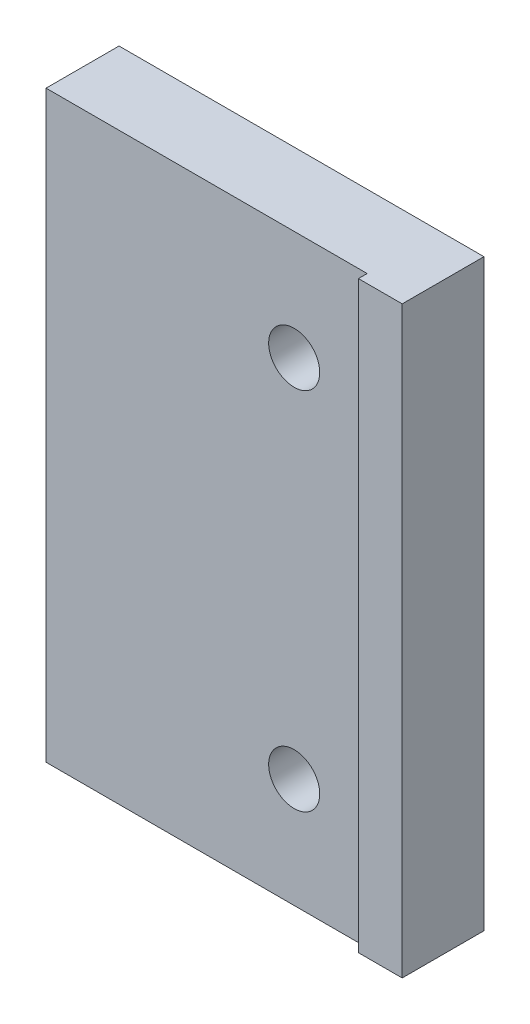
ISO-10303-21;
HEADER;
FILE_DESCRIPTION(('STEP AP214'),'2;1');
FILE_NAME('part.step','',(''),(''),'','','');
FILE_SCHEMA(('AUTOMOTIVE_DESIGN { 1 0 10303 214 1 1 1 1 }'));
ENDSEC;
DATA;
#1=APPLICATION_CONTEXT('core data for automotive mechanical design processes');
#2=APPLICATION_PROTOCOL_DEFINITION('international standard','automotive_design',2000,#1);
#3=PRODUCT_CONTEXT('',#1,'mechanical');
#4=PRODUCT('Part','Part','',(#3));
#5=PRODUCT_RELATED_PRODUCT_CATEGORY('part','',(#4));
#6=PRODUCT_DEFINITION_FORMATION('','',#4);
#7=PRODUCT_DEFINITION_CONTEXT('part definition',#1,'design');
#8=PRODUCT_DEFINITION('design','',#6,#7);
#9=PRODUCT_DEFINITION_SHAPE('','',#8);
#10=(LENGTH_UNIT() NAMED_UNIT(*) SI_UNIT(.MILLI.,.METRE.));
#11=(NAMED_UNIT(*) PLANE_ANGLE_UNIT() SI_UNIT($,.RADIAN.));
#12=(NAMED_UNIT(*) SI_UNIT($,.STERADIAN.) SOLID_ANGLE_UNIT());
#13=UNCERTAINTY_MEASURE_WITH_UNIT(LENGTH_MEASURE(1.E-05),#10,'distance_accuracy_value','');
#14=(GEOMETRIC_REPRESENTATION_CONTEXT(3) GLOBAL_UNCERTAINTY_ASSIGNED_CONTEXT((#13)) GLOBAL_UNIT_ASSIGNED_CONTEXT((#10,
#11,#12)) REPRESENTATION_CONTEXT('',''));
#15=CARTESIAN_POINT('',(0.,0.,0.));
#16=DIRECTION('',(0.,0.,1.));
#17=DIRECTION('',(1.,0.,0.));
#18=AXIS2_PLACEMENT_3D('',#15,#16,#17);
#19=CARTESIAN_POINT('',(0.,0.,5.));
#20=DIRECTION('',(0.,0.,-1.));
#21=DIRECTION('',(-1.,0.,0.));
#22=AXIS2_PLACEMENT_3D('',#19,#20,#21);
#23=PLANE('',#22);
#24=CARTESIAN_POINT('',(17.,7.5,5.));
#25=DIRECTION('',(0.,0.,1.));
#26=DIRECTION('',(1.,0.,0.));
#27=AXIS2_PLACEMENT_3D('',#24,#25,#26);
#28=CIRCLE('',#27,1.75);
#29=CARTESIAN_POINT('',(18.75,7.5,5.));
#30=VERTEX_POINT('',#29);
#31=EDGE_CURVE('E142',#30,#30,#28,.T.);
#32=ORIENTED_EDGE('',*,*,#31,.F.);
#33=EDGE_LOOP('',(#32));
#34=FACE_BOUND('',#33,.T.);
#35=CARTESIAN_POINT('',(17.,32.5,5.));
#36=DIRECTION('',(0.,0.,1.));
#37=DIRECTION('',(1.,0.,0.));
#38=AXIS2_PLACEMENT_3D('',#35,#36,#37);
#39=CIRCLE('',#38,1.75);
#40=CARTESIAN_POINT('',(18.75,32.5,5.));
#41=VERTEX_POINT('',#40);
#42=EDGE_CURVE('E97',#41,#41,#39,.T.);
#43=ORIENTED_EDGE('',*,*,#42,.F.);
#44=EDGE_LOOP('',(#43));
#45=FACE_BOUND('',#44,.T.);
#46=DIRECTION('',(0.,-1.,0.));
#47=VECTOR('',#46,1.);
#48=CARTESIAN_POINT('',(22.,40.,5.));
#49=LINE('',#48,#47);
#50=CARTESIAN_POINT('',(22.,40.,5.));
#51=VERTEX_POINT('',#50);
#52=CARTESIAN_POINT('',(22.,0.,5.));
#53=VERTEX_POINT('',#52);
#54=EDGE_CURVE('E50',#51,#53,#49,.T.);
#55=ORIENTED_EDGE('',*,*,#54,.F.);
#56=DIRECTION('',(-1.,0.,0.));
#57=VECTOR('',#56,1.);
#58=CARTESIAN_POINT('',(0.,40.,5.));
#59=LINE('',#58,#57);
#60=CARTESIAN_POINT('',(0.,40.,5.));
#61=VERTEX_POINT('',#60);
#62=EDGE_CURVE('E55',#51,#61,#59,.T.);
#63=ORIENTED_EDGE('',*,*,#62,.T.);
#64=DIRECTION('',(0.,-1.,0.));
#65=VECTOR('',#64,1.);
#66=CARTESIAN_POINT('',(0.,0.,5.));
#67=LINE('',#66,#65);
#68=CARTESIAN_POINT('',(0.,0.,5.));
#69=VERTEX_POINT('',#68);
#70=EDGE_CURVE('E86',#61,#69,#67,.T.);
#71=ORIENTED_EDGE('',*,*,#70,.T.);
#72=DIRECTION('',(1.,0.,0.));
#73=VECTOR('',#72,1.);
#74=CARTESIAN_POINT('',(0.,0.,5.));
#75=LINE('',#74,#73);
#76=EDGE_CURVE('E149',#69,#53,#75,.T.);
#77=ORIENTED_EDGE('',*,*,#76,.T.);
#78=EDGE_LOOP('',(#55,#63,#71,#77));
#79=FACE_BOUND('',#78,.T.);
#80=ADVANCED_FACE('F35',(#34,#45,#79),#23,.F.);
#81=CARTESIAN_POINT('',(0.,0.,0.));
#82=DIRECTION('',(0.,0.,-1.));
#83=DIRECTION('',(-1.,0.,0.));
#84=AXIS2_PLACEMENT_3D('',#81,#82,#83);
#85=PLANE('',#84);
#86=CARTESIAN_POINT('',(17.,32.5,0.));
#87=DIRECTION('',(0.,0.,1.));
#88=DIRECTION('',(1.,0.,0.));
#89=AXIS2_PLACEMENT_3D('',#86,#87,#88);
#90=CIRCLE('',#89,1.75);
#91=CARTESIAN_POINT('',(18.75,32.5,0.));
#92=VERTEX_POINT('',#91);
#93=EDGE_CURVE('E101',#92,#92,#90,.T.);
#94=ORIENTED_EDGE('',*,*,#93,.T.);
#95=EDGE_LOOP('',(#94));
#96=FACE_BOUND('',#95,.T.);
#97=DIRECTION('',(0.,-1.,0.));
#98=VECTOR('',#97,1.);
#99=CARTESIAN_POINT('',(0.,0.,0.));
#100=LINE('',#99,#98);
#101=CARTESIAN_POINT('',(0.,40.,0.));
#102=VERTEX_POINT('',#101);
#103=CARTESIAN_POINT('',(0.,0.,0.));
#104=VERTEX_POINT('',#103);
#105=EDGE_CURVE('E92',#102,#104,#100,.T.);
#106=ORIENTED_EDGE('',*,*,#105,.F.);
#107=DIRECTION('',(-1.,0.,0.));
#108=VECTOR('',#107,1.);
#109=CARTESIAN_POINT('',(0.,40.,0.));
#110=LINE('',#109,#108);
#111=CARTESIAN_POINT('',(25.,40.,0.));
#112=VERTEX_POINT('',#111);
#113=EDGE_CURVE('E75',#112,#102,#110,.T.);
#114=ORIENTED_EDGE('',*,*,#113,.F.);
#115=DIRECTION('',(0.,1.,0.));
#116=VECTOR('',#115,1.);
#117=CARTESIAN_POINT('',(25.,0.,0.));
#118=LINE('',#117,#116);
#119=CARTESIAN_POINT('',(25.,0.,0.));
#120=VERTEX_POINT('',#119);
#121=EDGE_CURVE('E87',#120,#112,#118,.T.);
#122=ORIENTED_EDGE('',*,*,#121,.F.);
#123=DIRECTION('',(1.,0.,0.));
#124=VECTOR('',#123,1.);
#125=CARTESIAN_POINT('',(0.,0.,0.));
#126=LINE('',#125,#124);
#127=EDGE_CURVE('E96',#104,#120,#126,.T.);
#128=ORIENTED_EDGE('',*,*,#127,.F.);
#129=EDGE_LOOP('',(#106,#114,#122,#128));
#130=FACE_BOUND('',#129,.T.);
#131=CARTESIAN_POINT('',(17.,7.5,0.));
#132=DIRECTION('',(0.,0.,1.));
#133=DIRECTION('',(1.,0.,0.));
#134=AXIS2_PLACEMENT_3D('',#131,#132,#133);
#135=CIRCLE('',#134,1.75);
#136=CARTESIAN_POINT('',(18.75,7.5,0.));
#137=VERTEX_POINT('',#136);
#138=EDGE_CURVE('E141',#137,#137,#135,.T.);
#139=ORIENTED_EDGE('',*,*,#138,.T.);
#140=EDGE_LOOP('',(#139));
#141=FACE_BOUND('',#140,.T.);
#142=ADVANCED_FACE('F94',(#96,#130,#141),#85,.T.);
#143=CARTESIAN_POINT('',(0.,0.,5.));
#144=DIRECTION('',(1.,0.,0.));
#145=DIRECTION('',(0.,0.,-1.));
#146=AXIS2_PLACEMENT_3D('',#143,#144,#145);
#147=PLANE('',#146);
#148=ORIENTED_EDGE('',*,*,#105,.T.);
#149=DIRECTION('',(0.,0.,-1.));
#150=VECTOR('',#149,1.);
#151=CARTESIAN_POINT('',(0.,0.,5.));
#152=LINE('',#151,#150);
#153=EDGE_CURVE('E11',#69,#104,#152,.T.);
#154=ORIENTED_EDGE('',*,*,#153,.F.);
#155=ORIENTED_EDGE('',*,*,#70,.F.);
#156=DIRECTION('',(0.,0.,-1.));
#157=VECTOR('',#156,1.);
#158=CARTESIAN_POINT('',(0.,40.,5.));
#159=LINE('',#158,#157);
#160=EDGE_CURVE('E78',#61,#102,#159,.T.);
#161=ORIENTED_EDGE('',*,*,#160,.T.);
#162=EDGE_LOOP('',(#148,#154,#155,#161));
#163=FACE_BOUND('',#162,.T.);
#164=ADVANCED_FACE('F37',(#163),#147,.F.);
#165=CARTESIAN_POINT('',(0.,0.,5.));
#166=DIRECTION('',(0.,1.,0.));
#167=DIRECTION('',(0.,0.,1.));
#168=AXIS2_PLACEMENT_3D('',#165,#166,#167);
#169=PLANE('',#168);
#170=ORIENTED_EDGE('',*,*,#127,.T.);
#171=DIRECTION('',(0.,0.,-1.));
#172=VECTOR('',#171,1.);
#173=CARTESIAN_POINT('',(25.,0.,5.));
#174=LINE('',#173,#172);
#175=CARTESIAN_POINT('',(25.,0.,5.6));
#176=VERTEX_POINT('',#175);
#177=EDGE_CURVE('E43',#176,#120,#174,.T.);
#178=ORIENTED_EDGE('',*,*,#177,.F.);
#179=DIRECTION('',(1.,0.,0.));
#180=VECTOR('',#179,1.);
#181=CARTESIAN_POINT('',(25.,0.,5.6));
#182=LINE('',#181,#180);
#183=CARTESIAN_POINT('',(22.,0.,5.6));
#184=VERTEX_POINT('',#183);
#185=EDGE_CURVE('E120',#184,#176,#182,.T.);
#186=ORIENTED_EDGE('',*,*,#185,.F.);
#187=DIRECTION('',(0.,0.,-1.));
#188=VECTOR('',#187,1.);
#189=CARTESIAN_POINT('',(22.,0.,5.6));
#190=LINE('',#189,#188);
#191=EDGE_CURVE('E130',#184,#53,#190,.T.);
#192=ORIENTED_EDGE('',*,*,#191,.T.);
#193=ORIENTED_EDGE('',*,*,#76,.F.);
#194=ORIENTED_EDGE('',*,*,#153,.T.);
#195=EDGE_LOOP('',(#170,#178,#186,#192,#193,#194));
#196=FACE_BOUND('',#195,.T.);
#197=ADVANCED_FACE('F117',(#196),#169,.F.);
#198=CARTESIAN_POINT('',(25.,0.,5.));
#199=DIRECTION('',(-1.,0.,0.));
#200=DIRECTION('',(0.,0.,1.));
#201=AXIS2_PLACEMENT_3D('',#198,#199,#200);
#202=PLANE('',#201);
#203=ORIENTED_EDGE('',*,*,#121,.T.);
#204=DIRECTION('',(0.,0.,-1.));
#205=VECTOR('',#204,1.);
#206=CARTESIAN_POINT('',(25.,40.,5.));
#207=LINE('',#206,#205);
#208=CARTESIAN_POINT('',(25.,40.,5.6));
#209=VERTEX_POINT('',#208);
#210=EDGE_CURVE('E82',#209,#112,#207,.T.);
#211=ORIENTED_EDGE('',*,*,#210,.F.);
#212=DIRECTION('',(0.,1.,0.));
#213=VECTOR('',#212,1.);
#214=CARTESIAN_POINT('',(25.,40.,5.6));
#215=LINE('',#214,#213);
#216=EDGE_CURVE('E113',#176,#209,#215,.T.);
#217=ORIENTED_EDGE('',*,*,#216,.F.);
#218=ORIENTED_EDGE('',*,*,#177,.T.);
#219=EDGE_LOOP('',(#203,#211,#217,#218));
#220=FACE_BOUND('',#219,.T.);
#221=ADVANCED_FACE('F111',(#220),#202,.F.);
#222=CARTESIAN_POINT('',(0.,40.,5.));
#223=DIRECTION('',(0.,-1.,0.));
#224=DIRECTION('',(0.,0.,-1.));
#225=AXIS2_PLACEMENT_3D('',#222,#223,#224);
#226=PLANE('',#225);
#227=ORIENTED_EDGE('',*,*,#113,.T.);
#228=ORIENTED_EDGE('',*,*,#160,.F.);
#229=ORIENTED_EDGE('',*,*,#62,.F.);
#230=DIRECTION('',(0.,0.,-1.));
#231=VECTOR('',#230,1.);
#232=CARTESIAN_POINT('',(22.,40.,5.6));
#233=LINE('',#232,#231);
#234=CARTESIAN_POINT('',(22.,40.,5.6));
#235=VERTEX_POINT('',#234);
#236=EDGE_CURVE('E132',#235,#51,#233,.T.);
#237=ORIENTED_EDGE('',*,*,#236,.F.);
#238=DIRECTION('',(-1.,0.,0.));
#239=VECTOR('',#238,1.);
#240=CARTESIAN_POINT('',(25.,40.,5.6));
#241=LINE('',#240,#239);
#242=EDGE_CURVE('E134',#209,#235,#241,.T.);
#243=ORIENTED_EDGE('',*,*,#242,.F.);
#244=ORIENTED_EDGE('',*,*,#210,.T.);
#245=EDGE_LOOP('',(#227,#228,#229,#237,#243,#244));
#246=FACE_BOUND('',#245,.T.);
#247=ADVANCED_FACE('F77',(#246),#226,.F.);
#248=CARTESIAN_POINT('',(17.,32.5,5.));
#249=DIRECTION('',(0.,0.,-1.));
#250=DIRECTION('',(-1.,0.,0.));
#251=AXIS2_PLACEMENT_3D('',#248,#249,#250);
#252=CYLINDRICAL_SURFACE('',#251,1.75);
#253=ORIENTED_EDGE('',*,*,#42,.T.);
#254=EDGE_LOOP('',(#253));
#255=FACE_BOUND('',#254,.T.);
#256=ORIENTED_EDGE('',*,*,#93,.F.);
#257=EDGE_LOOP('',(#256));
#258=FACE_BOUND('',#257,.T.);
#259=ADVANCED_FACE('F167',(#255,#258),#252,.F.);
#260=CARTESIAN_POINT('',(17.,7.5,5.));
#261=DIRECTION('',(0.,0.,-1.));
#262=DIRECTION('',(-1.,0.,0.));
#263=AXIS2_PLACEMENT_3D('',#260,#261,#262);
#264=CYLINDRICAL_SURFACE('',#263,1.75);
#265=ORIENTED_EDGE('',*,*,#31,.T.);
#266=EDGE_LOOP('',(#265));
#267=FACE_BOUND('',#266,.T.);
#268=ORIENTED_EDGE('',*,*,#138,.F.);
#269=EDGE_LOOP('',(#268));
#270=FACE_BOUND('',#269,.T.);
#271=ADVANCED_FACE('F160',(#267,#270),#264,.F.);
#272=CARTESIAN_POINT('',(22.,40.,5.6));
#273=DIRECTION('',(1.,0.,0.));
#274=DIRECTION('',(0.,1.,0.));
#275=AXIS2_PLACEMENT_3D('',#272,#273,#274);
#276=PLANE('',#275);
#277=ORIENTED_EDGE('',*,*,#54,.T.);
#278=ORIENTED_EDGE('',*,*,#191,.F.);
#279=DIRECTION('',(0.,-1.,0.));
#280=VECTOR('',#279,1.);
#281=CARTESIAN_POINT('',(22.,40.,5.6));
#282=LINE('',#281,#280);
#283=EDGE_CURVE('E128',#235,#184,#282,.T.);
#284=ORIENTED_EDGE('',*,*,#283,.F.);
#285=ORIENTED_EDGE('',*,*,#236,.T.);
#286=EDGE_LOOP('',(#277,#278,#284,#285));
#287=FACE_BOUND('',#286,.T.);
#288=ADVANCED_FACE('F152',(#287),#276,.F.);
#289=CARTESIAN_POINT('',(0.,0.,5.6));
#290=DIRECTION('',(0.,0.,-1.));
#291=DIRECTION('',(-1.,0.,0.));
#292=AXIS2_PLACEMENT_3D('',#289,#290,#291);
#293=PLANE('',#292);
#294=ORIENTED_EDGE('',*,*,#216,.T.);
#295=ORIENTED_EDGE('',*,*,#242,.T.);
#296=ORIENTED_EDGE('',*,*,#283,.T.);
#297=ORIENTED_EDGE('',*,*,#185,.T.);
#298=EDGE_LOOP('',(#294,#295,#296,#297));
#299=FACE_BOUND('',#298,.T.);
#300=ADVANCED_FACE('F124',(#299),#293,.F.);
#301=CLOSED_SHELL('',(#80,#142,#164,#197,#221,#247,#259,#271,#288,#300));
#302=MANIFOLD_SOLID_BREP('B2',#301);
#303=ADVANCED_BREP_SHAPE_REPRESENTATION('',(#18,#302),#14);
#304=SHAPE_DEFINITION_REPRESENTATION(#9,#303);
ENDSEC;
END-ISO-10303-21;
